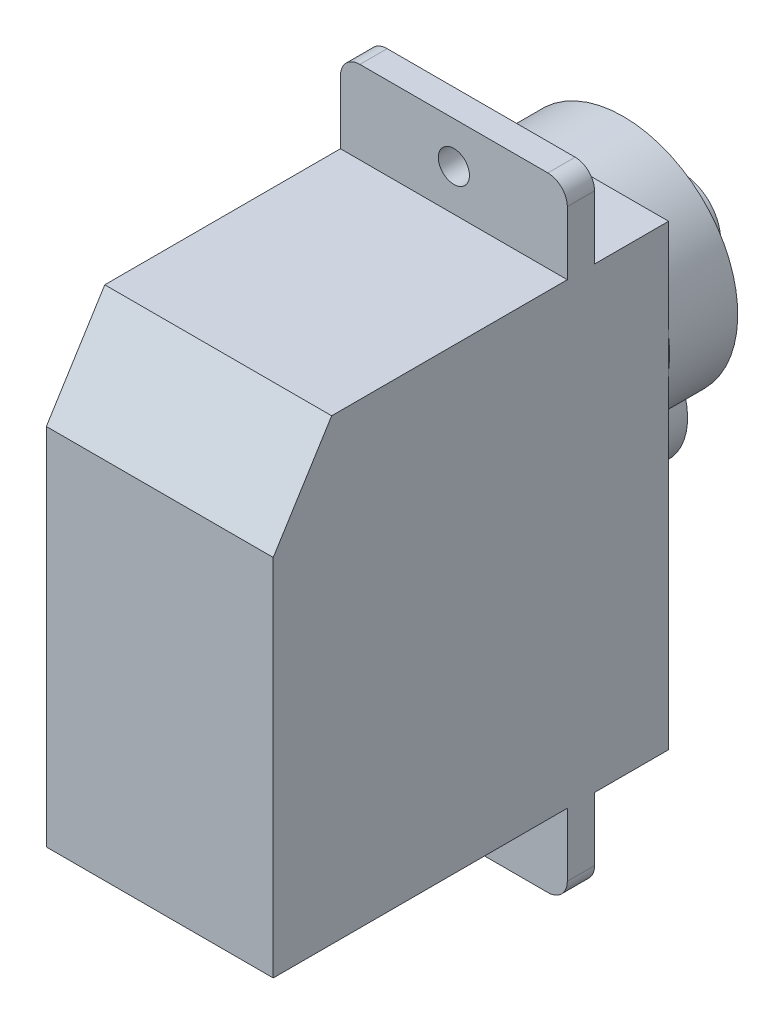
ISO-10303-21;
HEADER;
FILE_DESCRIPTION(('STEP AP214'),'2;1');
FILE_NAME('part.step','',(''),(''),'','','');
FILE_SCHEMA(('AUTOMOTIVE_DESIGN { 1 0 10303 214 1 1 1 1 }'));
ENDSEC;
DATA;
#1=APPLICATION_CONTEXT('core data for automotive mechanical design processes');
#2=APPLICATION_PROTOCOL_DEFINITION('international standard','automotive_design',2000,#1);
#3=PRODUCT_CONTEXT('',#1,'mechanical');
#4=PRODUCT('Part','Part','',(#3));
#5=PRODUCT_RELATED_PRODUCT_CATEGORY('part','',(#4));
#6=PRODUCT_DEFINITION_FORMATION('','',#4);
#7=PRODUCT_DEFINITION_CONTEXT('part definition',#1,'design');
#8=PRODUCT_DEFINITION('design','',#6,#7);
#9=PRODUCT_DEFINITION_SHAPE('','',#8);
#10=(LENGTH_UNIT() NAMED_UNIT(*) SI_UNIT(.MILLI.,.METRE.));
#11=(NAMED_UNIT(*) PLANE_ANGLE_UNIT() SI_UNIT($,.RADIAN.));
#12=(NAMED_UNIT(*) SI_UNIT($,.STERADIAN.) SOLID_ANGLE_UNIT());
#13=UNCERTAINTY_MEASURE_WITH_UNIT(LENGTH_MEASURE(1.E-05),#10,'distance_accuracy_value','');
#14=(GEOMETRIC_REPRESENTATION_CONTEXT(3) GLOBAL_UNCERTAINTY_ASSIGNED_CONTEXT((#13)) GLOBAL_UNIT_ASSIGNED_CONTEXT((#10,
#11,#12)) REPRESENTATION_CONTEXT('',''));
#15=CARTESIAN_POINT('',(0.,0.,0.));
#16=DIRECTION('',(0.,0.,1.));
#17=DIRECTION('',(1.,0.,0.));
#18=AXIS2_PLACEMENT_3D('',#15,#16,#17);
#19=CARTESIAN_POINT('',(-5.875,11.75,5.2));
#20=DIRECTION('',(0.,0.,-1.));
#21=DIRECTION('',(-1.,0.,0.));
#22=AXIS2_PLACEMENT_3D('',#19,#20,#21);
#23=PLANE('',#22);
#24=DIRECTION('',(0.,1.,0.));
#25=VECTOR('',#24,1.);
#26=CARTESIAN_POINT('',(5.825,11.75,5.2));
#27=LINE('',#26,#25);
#28=CARTESIAN_POINT('',(5.825,11.75,5.2));
#29=VERTEX_POINT('',#28);
#30=CARTESIAN_POINT('',(5.825,15.,5.2));
#31=VERTEX_POINT('',#30);
#32=EDGE_CURVE('E192',#29,#31,#27,.T.);
#33=ORIENTED_EDGE('',*,*,#32,.T.);
#34=CARTESIAN_POINT('',(4.825,15.,5.2));
#35=DIRECTION('',(0.,0.,-1.));
#36=DIRECTION('',(-1.,0.,0.));
#37=AXIS2_PLACEMENT_3D('',#34,#35,#36);
#38=CIRCLE('',#37,1.);
#39=CARTESIAN_POINT('',(4.825,16.,5.2));
#40=VERTEX_POINT('',#39);
#41=EDGE_CURVE('E331',#31,#40,#38,.F.);
#42=ORIENTED_EDGE('',*,*,#41,.T.);
#43=DIRECTION('',(1.,0.,0.));
#44=VECTOR('',#43,1.);
#45=CARTESIAN_POINT('',(-5.875,16.,5.2));
#46=LINE('',#45,#44);
#47=CARTESIAN_POINT('',(-4.825,16.,5.2));
#48=VERTEX_POINT('',#47);
#49=EDGE_CURVE('E201',#48,#40,#46,.T.);
#50=ORIENTED_EDGE('',*,*,#49,.F.);
#51=CARTESIAN_POINT('',(-4.825,15.,5.2));
#52=DIRECTION('',(0.,0.,-1.));
#53=DIRECTION('',(-1.,0.,0.));
#54=AXIS2_PLACEMENT_3D('',#51,#52,#53);
#55=CIRCLE('',#54,1.);
#56=CARTESIAN_POINT('',(-5.825,15.,5.2));
#57=VERTEX_POINT('',#56);
#58=EDGE_CURVE('E329',#48,#57,#55,.F.);
#59=ORIENTED_EDGE('',*,*,#58,.T.);
#60=DIRECTION('',(0.,-1.,0.));
#61=VECTOR('',#60,1.);
#62=CARTESIAN_POINT('',(-5.825,0.,5.2));
#63=LINE('',#62,#61);
#64=CARTESIAN_POINT('',(-5.825,11.75,5.2));
#65=VERTEX_POINT('',#64);
#66=EDGE_CURVE('E200',#57,#65,#63,.T.);
#67=ORIENTED_EDGE('',*,*,#66,.T.);
#68=DIRECTION('',(1.,0.,0.));
#69=VECTOR('',#68,1.);
#70=CARTESIAN_POINT('',(-5.875,11.75,5.2));
#71=LINE('',#70,#69);
#72=EDGE_CURVE('E186',#65,#29,#71,.T.);
#73=ORIENTED_EDGE('',*,*,#72,.T.);
#74=EDGE_LOOP('',(#33,#42,#50,#59,#67,#73));
#75=FACE_BOUND('',#74,.T.);
#76=CARTESIAN_POINT('',(0.,13.875,5.20000000000001));
#77=DIRECTION('',(0.,0.,1.));
#78=DIRECTION('',(1.,0.,0.));
#79=AXIS2_PLACEMENT_3D('',#76,#77,#78);
#80=CIRCLE('',#79,0.799999999999988);
#81=CARTESIAN_POINT('',(0.799999999999986,13.875,5.20000000000001));
#82=VERTEX_POINT('',#81);
#83=EDGE_CURVE('E308',#82,#82,#80,.T.);
#84=ORIENTED_EDGE('',*,*,#83,.F.);
#85=EDGE_LOOP('',(#84));
#86=FACE_BOUND('',#85,.T.);
#87=ADVANCED_FACE('F34',(#75,#86),#23,.F.);
#88=CARTESIAN_POINT('',(5.825,16.,0.));
#89=DIRECTION('',(0.,0.,-1.));
#90=DIRECTION('',(-1.,0.,0.));
#91=AXIS2_PLACEMENT_3D('',#88,#89,#90);
#92=PLANE('',#91);
#93=DIRECTION('',(-1.,0.,0.));
#94=VECTOR('',#93,1.);
#95=CARTESIAN_POINT('',(5.87500000000001,11.75,0.));
#96=LINE('',#95,#94);
#97=CARTESIAN_POINT('',(5.825,11.75,0.));
#98=VERTEX_POINT('',#97);
#99=CARTESIAN_POINT('',(0.,11.75,0.));
#100=VERTEX_POINT('',#99);
#101=EDGE_CURVE('E251',#98,#100,#96,.T.);
#102=ORIENTED_EDGE('',*,*,#101,.F.);
#103=DIRECTION('',(0.,-1.,0.));
#104=VECTOR('',#103,1.);
#105=CARTESIAN_POINT('',(5.825,16.,0.));
#106=LINE('',#105,#104);
#107=CARTESIAN_POINT('',(5.825,6.63985292703891,0.));
#108=VERTEX_POINT('',#107);
#109=EDGE_CURVE('E279',#98,#108,#106,.T.);
#110=ORIENTED_EDGE('',*,*,#109,.T.);
#111=CARTESIAN_POINT('',(0.,5.875,0.));
#112=DIRECTION('',(0.,0.,-1.));
#113=DIRECTION('',(1.,0.,0.));
#114=AXIS2_PLACEMENT_3D('',#111,#112,#113);
#115=CIRCLE('',#114,5.875);
#116=EDGE_CURVE('E271',#100,#108,#115,.T.);
#117=ORIENTED_EDGE('',*,*,#116,.F.);
#118=EDGE_LOOP('',(#102,#110,#117));
#119=FACE_BOUND('',#118,.T.);
#120=ADVANCED_FACE('F403',(#119),#92,.T.);
#121=CARTESIAN_POINT('',(-5.825,11.75,0.));
#122=VERTEX_POINT('',#121);
#123=EDGE_CURVE('E244',#100,#122,#96,.T.);
#124=ORIENTED_EDGE('',*,*,#123,.F.);
#125=CARTESIAN_POINT('',(-5.825,6.6398529270389,0.));
#126=VERTEX_POINT('',#125);
#127=EDGE_CURVE('E295',#126,#100,#115,.T.);
#128=ORIENTED_EDGE('',*,*,#127,.F.);
#129=DIRECTION('',(0.,-1.,0.));
#130=VECTOR('',#129,1.);
#131=CARTESIAN_POINT('',(-5.825,16.,0.));
#132=LINE('',#131,#130);
#133=EDGE_CURVE('E286',#122,#126,#132,.T.);
#134=ORIENTED_EDGE('',*,*,#133,.F.);
#135=EDGE_LOOP('',(#124,#128,#134));
#136=FACE_BOUND('',#135,.T.);
#137=ADVANCED_FACE('F362',(#136),#92,.T.);
#138=DIRECTION('',(1.,0.,0.));
#139=VECTOR('',#138,1.);
#140=CARTESIAN_POINT('',(-5.875,-11.75,0.));
#141=LINE('',#140,#139);
#142=CARTESIAN_POINT('',(-5.825,-11.75,0.));
#143=VERTEX_POINT('',#142);
#144=CARTESIAN_POINT('',(5.825,-11.75,0.));
#145=VERTEX_POINT('',#144);
#146=EDGE_CURVE('E232',#143,#145,#141,.T.);
#147=ORIENTED_EDGE('',*,*,#146,.F.);
#148=CARTESIAN_POINT('',(-5.825,5.1101470729611,0.));
#149=VERTEX_POINT('',#148);
#150=EDGE_CURVE('E278',#149,#143,#132,.T.);
#151=ORIENTED_EDGE('',*,*,#150,.F.);
#152=CARTESIAN_POINT('',(-3.16717949990341,0.926808510638299,0.));
#153=VERTEX_POINT('',#152);
#154=EDGE_CURVE('E262',#153,#149,#115,.T.);
#155=ORIENTED_EDGE('',*,*,#154,.F.);
#156=CARTESIAN_POINT('',(0.,0.,0.));
#157=DIRECTION('',(0.,0.,-1.));
#158=DIRECTION('',(1.,0.,0.));
#159=AXIS2_PLACEMENT_3D('',#156,#157,#158);
#160=CIRCLE('',#159,3.3);
#161=CARTESIAN_POINT('',(3.16717949990341,0.926808510638298,0.));
#162=VERTEX_POINT('',#161);
#163=EDGE_CURVE('E257',#162,#153,#160,.T.);
#164=ORIENTED_EDGE('',*,*,#163,.F.);
#165=CARTESIAN_POINT('',(5.825,5.11014707296108,0.));
#166=VERTEX_POINT('',#165);
#167=EDGE_CURVE('E272',#166,#162,#115,.T.);
#168=ORIENTED_EDGE('',*,*,#167,.F.);
#169=EDGE_CURVE('E283',#166,#145,#106,.T.);
#170=ORIENTED_EDGE('',*,*,#169,.T.);
#171=EDGE_LOOP('',(#147,#151,#155,#164,#168,#170));
#172=FACE_BOUND('',#171,.T.);
#173=ADVANCED_FACE('F410',(#172),#92,.T.);
#174=CARTESIAN_POINT('',(5.825,16.,20.3));
#175=DIRECTION('',(0.,1.,0.));
#176=DIRECTION('',(-1.,0.,0.));
#177=AXIS2_PLACEMENT_3D('',#174,#175,#176);
#178=PLANE('',#177);
#179=ORIENTED_EDGE('',*,*,#49,.T.);
#180=DIRECTION('',(0.,0.,-1.));
#181=VECTOR('',#180,1.);
#182=CARTESIAN_POINT('',(4.825,16.,3.8));
#183=LINE('',#182,#181);
#184=CARTESIAN_POINT('',(4.825,16.,3.8));
#185=VERTEX_POINT('',#184);
#186=EDGE_CURVE('E319',#40,#185,#183,.T.);
#187=ORIENTED_EDGE('',*,*,#186,.T.);
#188=DIRECTION('',(-1.,0.,0.));
#189=VECTOR('',#188,1.);
#190=CARTESIAN_POINT('',(5.87500000000001,16.,3.8));
#191=LINE('',#190,#189);
#192=CARTESIAN_POINT('',(-4.825,16.,3.8));
#193=VERTEX_POINT('',#192);
#194=EDGE_CURVE('E245',#185,#193,#191,.T.);
#195=ORIENTED_EDGE('',*,*,#194,.T.);
#196=DIRECTION('',(0.,0.,-1.));
#197=VECTOR('',#196,1.);
#198=CARTESIAN_POINT('',(-4.825,16.,20.3));
#199=LINE('',#198,#197);
#200=EDGE_CURVE('E317',#193,#48,#199,.F.);
#201=ORIENTED_EDGE('',*,*,#200,.T.);
#202=EDGE_LOOP('',(#179,#187,#195,#201));
#203=FACE_BOUND('',#202,.T.);
#204=ADVANCED_FACE('F654',(#203),#178,.T.);
#205=CARTESIAN_POINT('',(5.825,-16.,20.3));
#206=DIRECTION('',(0.,0.,1.));
#207=DIRECTION('',(1.,0.,0.));
#208=AXIS2_PLACEMENT_3D('',#205,#206,#207);
#209=PLANE('',#208);
#210=DIRECTION('',(0.,1.,0.));
#211=VECTOR('',#210,1.);
#212=CARTESIAN_POINT('',(5.825,-16.,20.3));
#213=LINE('',#212,#211);
#214=CARTESIAN_POINT('',(5.825,-11.75,20.3));
#215=VERTEX_POINT('',#214);
#216=CARTESIAN_POINT('',(5.825,6.95,20.3));
#217=VERTEX_POINT('',#216);
#218=EDGE_CURVE('E281',#215,#217,#213,.T.);
#219=ORIENTED_EDGE('',*,*,#218,.T.);
#220=DIRECTION('',(-1.,0.,0.));
#221=VECTOR('',#220,1.);
#222=CARTESIAN_POINT('',(-5.825,6.95,20.3));
#223=LINE('',#222,#221);
#224=CARTESIAN_POINT('',(-5.825,6.95,20.3));
#225=VERTEX_POINT('',#224);
#226=EDGE_CURVE('E313',#217,#225,#223,.T.);
#227=ORIENTED_EDGE('',*,*,#226,.T.);
#228=DIRECTION('',(0.,1.,0.));
#229=VECTOR('',#228,1.);
#230=CARTESIAN_POINT('',(-5.825,-16.,20.3));
#231=LINE('',#230,#229);
#232=CARTESIAN_POINT('',(-5.825,-11.75,20.3));
#233=VERTEX_POINT('',#232);
#234=EDGE_CURVE('E288',#233,#225,#231,.T.);
#235=ORIENTED_EDGE('',*,*,#234,.F.);
#236=DIRECTION('',(1.,0.,0.));
#237=VECTOR('',#236,1.);
#238=CARTESIAN_POINT('',(-5.875,-11.75,20.3));
#239=LINE('',#238,#237);
#240=EDGE_CURVE('E221',#233,#215,#239,.T.);
#241=ORIENTED_EDGE('',*,*,#240,.T.);
#242=EDGE_LOOP('',(#219,#227,#235,#241));
#243=FACE_BOUND('',#242,.T.);
#244=ADVANCED_FACE('F646',(#243),#209,.T.);
#245=CARTESIAN_POINT('',(5.825,-16.,0.));
#246=DIRECTION('',(0.,-1.,0.));
#247=DIRECTION('',(1.,0.,0.));
#248=AXIS2_PLACEMENT_3D('',#245,#246,#247);
#249=PLANE('',#248);
#250=DIRECTION('',(1.,0.,0.));
#251=VECTOR('',#250,1.);
#252=CARTESIAN_POINT('',(-5.875,-16.,3.8));
#253=LINE('',#252,#251);
#254=CARTESIAN_POINT('',(-4.825,-16.,3.8));
#255=VERTEX_POINT('',#254);
#256=CARTESIAN_POINT('',(4.825,-16.,3.8));
#257=VERTEX_POINT('',#256);
#258=EDGE_CURVE('E235',#255,#257,#253,.T.);
#259=ORIENTED_EDGE('',*,*,#258,.T.);
#260=DIRECTION('',(0.,0.,1.));
#261=VECTOR('',#260,1.);
#262=CARTESIAN_POINT('',(4.825,-16.,5.2));
#263=LINE('',#262,#261);
#264=CARTESIAN_POINT('',(4.825,-16.,5.2));
#265=VERTEX_POINT('',#264);
#266=EDGE_CURVE('E335',#257,#265,#263,.T.);
#267=ORIENTED_EDGE('',*,*,#266,.T.);
#268=DIRECTION('',(1.,0.,0.));
#269=VECTOR('',#268,1.);
#270=CARTESIAN_POINT('',(-5.875,-16.,5.2));
#271=LINE('',#270,#269);
#272=CARTESIAN_POINT('',(-4.825,-16.,5.2));
#273=VERTEX_POINT('',#272);
#274=EDGE_CURVE('E217',#273,#265,#271,.T.);
#275=ORIENTED_EDGE('',*,*,#274,.F.);
#276=DIRECTION('',(0.,0.,1.));
#277=VECTOR('',#276,1.);
#278=CARTESIAN_POINT('',(-4.82500000000001,-16.,0.));
#279=LINE('',#278,#277);
#280=EDGE_CURVE('E333',#273,#255,#279,.F.);
#281=ORIENTED_EDGE('',*,*,#280,.T.);
#282=EDGE_LOOP('',(#259,#267,#275,#281));
#283=FACE_BOUND('',#282,.T.);
#284=ADVANCED_FACE('F638',(#283),#249,.T.);
#285=CARTESIAN_POINT('',(5.825,0.,0.));
#286=DIRECTION('',(-1.,0.,0.));
#287=DIRECTION('',(0.,-1.,0.));
#288=AXIS2_PLACEMENT_3D('',#285,#286,#287);
#289=PLANE('',#288);
#290=DIRECTION('',(0.,1.,0.));
#291=VECTOR('',#290,1.);
#292=CARTESIAN_POINT('',(5.825,0.,3.8));
#293=LINE('',#292,#291);
#294=CARTESIAN_POINT('',(5.825,11.75,3.8));
#295=VERTEX_POINT('',#294);
#296=CARTESIAN_POINT('',(5.825,15.,3.8));
#297=VERTEX_POINT('',#296);
#298=EDGE_CURVE('E255',#295,#297,#293,.T.);
#299=ORIENTED_EDGE('',*,*,#298,.T.);
#300=DIRECTION('',(0.,0.,-1.));
#301=VECTOR('',#300,1.);
#302=CARTESIAN_POINT('',(5.825,15.,5.2));
#303=LINE('',#302,#301);
#304=EDGE_CURVE('E206',#297,#31,#303,.F.);
#305=ORIENTED_EDGE('',*,*,#304,.T.);
#306=ORIENTED_EDGE('',*,*,#32,.F.);
#307=DIRECTION('',(0.,0.,-1.));
#308=VECTOR('',#307,1.);
#309=CARTESIAN_POINT('',(5.825,11.75,20.3));
#310=LINE('',#309,#308);
#311=CARTESIAN_POINT('',(5.825,11.75,17.3));
#312=VERTEX_POINT('',#311);
#313=EDGE_CURVE('E182',#312,#29,#310,.T.);
#314=ORIENTED_EDGE('',*,*,#313,.F.);
#315=DIRECTION('',(0.,-0.847998304005087,0.529998940003182));
#316=VECTOR('',#315,1.);
#317=CARTESIAN_POINT('',(5.825,11.75,17.3));
#318=LINE('',#317,#316);
#319=EDGE_CURVE('E311',#312,#217,#318,.T.);
#320=ORIENTED_EDGE('',*,*,#319,.T.);
#321=ORIENTED_EDGE('',*,*,#218,.F.);
#322=DIRECTION('',(0.,0.,1.));
#323=VECTOR('',#322,1.);
#324=CARTESIAN_POINT('',(5.825,-11.75,5.2));
#325=LINE('',#324,#323);
#326=CARTESIAN_POINT('',(5.825,-11.75,5.2));
#327=VERTEX_POINT('',#326);
#328=EDGE_CURVE('E214',#327,#215,#325,.T.);
#329=ORIENTED_EDGE('',*,*,#328,.F.);
#330=DIRECTION('',(0.,1.,0.));
#331=VECTOR('',#330,1.);
#332=CARTESIAN_POINT('',(5.825,-16.,5.2));
#333=LINE('',#332,#331);
#334=CARTESIAN_POINT('',(5.825,-15.,5.2));
#335=VERTEX_POINT('',#334);
#336=EDGE_CURVE('E211',#335,#327,#333,.T.);
#337=ORIENTED_EDGE('',*,*,#336,.F.);
#338=DIRECTION('',(0.,0.,1.));
#339=VECTOR('',#338,1.);
#340=CARTESIAN_POINT('',(5.825,-15.,3.8));
#341=LINE('',#340,#339);
#342=CARTESIAN_POINT('',(5.825,-15.,3.8));
#343=VERTEX_POINT('',#342);
#344=EDGE_CURVE('E326',#335,#343,#341,.F.);
#345=ORIENTED_EDGE('',*,*,#344,.T.);
#346=DIRECTION('',(0.,-1.,0.));
#347=VECTOR('',#346,1.);
#348=CARTESIAN_POINT('',(5.825,-11.75,3.8));
#349=LINE('',#348,#347);
#350=CARTESIAN_POINT('',(5.825,-11.75,3.8));
#351=VERTEX_POINT('',#350);
#352=EDGE_CURVE('E228',#351,#343,#349,.T.);
#353=ORIENTED_EDGE('',*,*,#352,.F.);
#354=DIRECTION('',(0.,0.,1.));
#355=VECTOR('',#354,1.);
#356=CARTESIAN_POINT('',(5.825,-11.75,0.));
#357=LINE('',#356,#355);
#358=EDGE_CURVE('E220',#145,#351,#357,.T.);
#359=ORIENTED_EDGE('',*,*,#358,.F.);
#360=ORIENTED_EDGE('',*,*,#169,.F.);
#361=EDGE_CURVE('E282',#108,#166,#106,.T.);
#362=ORIENTED_EDGE('',*,*,#361,.F.);
#363=ORIENTED_EDGE('',*,*,#109,.F.);
#364=DIRECTION('',(0.,0.,1.));
#365=VECTOR('',#364,1.);
#366=CARTESIAN_POINT('',(5.825,11.75,0.));
#367=LINE('',#366,#365);
#368=EDGE_CURVE('E248',#98,#295,#367,.T.);
#369=ORIENTED_EDGE('',*,*,#368,.T.);
#370=EDGE_LOOP('',(#299,#305,#306,#314,#320,#321,#329,#337,#345,#353,#359,#360,#362,#363,#369));
#371=FACE_BOUND('',#370,.T.);
#372=ADVANCED_FACE('F204',(#371),#289,.F.);
#373=CARTESIAN_POINT('',(-5.825,0.,0.));
#374=DIRECTION('',(-1.,0.,0.));
#375=DIRECTION('',(0.,-1.,0.));
#376=AXIS2_PLACEMENT_3D('',#373,#374,#375);
#377=PLANE('',#376);
#378=DIRECTION('',(0.,1.,0.));
#379=VECTOR('',#378,1.);
#380=CARTESIAN_POINT('',(-5.825,0.,3.80000000000001));
#381=LINE('',#380,#379);
#382=CARTESIAN_POINT('',(-5.825,-15.,3.8));
#383=VERTEX_POINT('',#382);
#384=CARTESIAN_POINT('',(-5.825,-11.75,3.8));
#385=VERTEX_POINT('',#384);
#386=EDGE_CURVE('E292',#383,#385,#381,.T.);
#387=ORIENTED_EDGE('',*,*,#386,.F.);
#388=DIRECTION('',(0.,0.,1.));
#389=VECTOR('',#388,1.);
#390=CARTESIAN_POINT('',(-5.825,-15.,0.));
#391=LINE('',#390,#389);
#392=CARTESIAN_POINT('',(-5.825,-15.,5.2));
#393=VERTEX_POINT('',#392);
#394=EDGE_CURVE('E11',#383,#393,#391,.T.);
#395=ORIENTED_EDGE('',*,*,#394,.T.);
#396=DIRECTION('',(0.,-1.,0.));
#397=VECTOR('',#396,1.);
#398=CARTESIAN_POINT('',(-5.825,0.,5.20000000000001));
#399=LINE('',#398,#397);
#400=CARTESIAN_POINT('',(-5.825,-11.75,5.2));
#401=VERTEX_POINT('',#400);
#402=EDGE_CURVE('E299',#401,#393,#399,.T.);
#403=ORIENTED_EDGE('',*,*,#402,.F.);
#404=DIRECTION('',(0.,0.,-1.));
#405=VECTOR('',#404,1.);
#406=CARTESIAN_POINT('',(-5.825,-11.75,0.));
#407=LINE('',#406,#405);
#408=EDGE_CURVE('E297',#233,#401,#407,.T.);
#409=ORIENTED_EDGE('',*,*,#408,.F.);
#410=ORIENTED_EDGE('',*,*,#234,.T.);
#411=DIRECTION('',(0.,0.847998304005087,-0.529998940003182));
#412=VECTOR('',#411,1.);
#413=CARTESIAN_POINT('',(-5.825,11.0758426966293,17.7213483146067));
#414=LINE('',#413,#412);
#415=CARTESIAN_POINT('',(-5.825,11.75,17.3));
#416=VERTEX_POINT('',#415);
#417=EDGE_CURVE('E315',#225,#416,#414,.T.);
#418=ORIENTED_EDGE('',*,*,#417,.T.);
#419=DIRECTION('',(0.,0.,1.));
#420=VECTOR('',#419,1.);
#421=CARTESIAN_POINT('',(-5.825,11.75,0.));
#422=LINE('',#421,#420);
#423=EDGE_CURVE('E303',#65,#416,#422,.T.);
#424=ORIENTED_EDGE('',*,*,#423,.F.);
#425=ORIENTED_EDGE('',*,*,#66,.F.);
#426=DIRECTION('',(0.,0.,-1.));
#427=VECTOR('',#426,1.);
#428=CARTESIAN_POINT('',(-5.825,15.,0.));
#429=LINE('',#428,#427);
#430=CARTESIAN_POINT('',(-5.825,15.,3.8));
#431=VERTEX_POINT('',#430);
#432=EDGE_CURVE('E42',#57,#431,#429,.T.);
#433=ORIENTED_EDGE('',*,*,#432,.T.);
#434=DIRECTION('',(0.,1.,0.));
#435=VECTOR('',#434,1.);
#436=CARTESIAN_POINT('',(-5.825,11.75,3.8));
#437=LINE('',#436,#435);
#438=CARTESIAN_POINT('',(-5.825,11.75,3.8));
#439=VERTEX_POINT('',#438);
#440=EDGE_CURVE('E241',#439,#431,#437,.T.);
#441=ORIENTED_EDGE('',*,*,#440,.F.);
#442=DIRECTION('',(0.,0.,1.));
#443=VECTOR('',#442,1.);
#444=CARTESIAN_POINT('',(-5.825,11.75,0.));
#445=LINE('',#444,#443);
#446=EDGE_CURVE('E234',#122,#439,#445,.T.);
#447=ORIENTED_EDGE('',*,*,#446,.F.);
#448=ORIENTED_EDGE('',*,*,#133,.T.);
#449=EDGE_CURVE('E289',#126,#149,#132,.T.);
#450=ORIENTED_EDGE('',*,*,#449,.T.);
#451=ORIENTED_EDGE('',*,*,#150,.T.);
#452=DIRECTION('',(0.,0.,-1.));
#453=VECTOR('',#452,1.);
#454=CARTESIAN_POINT('',(-5.825,-11.75,0.));
#455=LINE('',#454,#453);
#456=EDGE_CURVE('E294',#385,#143,#455,.T.);
#457=ORIENTED_EDGE('',*,*,#456,.F.);
#458=EDGE_LOOP('',(#387,#395,#403,#409,#410,#418,#424,#425,#433,#441,#447,#448,#450,#451,#457));
#459=FACE_BOUND('',#458,.T.);
#460=ADVANCED_FACE('F347',(#459),#377,.T.);
#461=CARTESIAN_POINT('',(0.,2.9375,0.));
#462=DIRECTION('',(0.,0.,1.));
#463=DIRECTION('',(1.,0.,0.));
#464=AXIS2_PLACEMENT_3D('',#461,#462,#463);
#465=PLANE('',#464);
#466=ORIENTED_EDGE('',*,*,#449,.F.);
#467=EDGE_CURVE('E270',#149,#126,#115,.T.);
#468=ORIENTED_EDGE('',*,*,#467,.F.);
#469=EDGE_LOOP('',(#466,#468));
#470=FACE_BOUND('',#469,.T.);
#471=ADVANCED_FACE('F371',(#470),#465,.T.);
#472=CARTESIAN_POINT('',(0.,0.,-3.5));
#473=DIRECTION('',(0.,0.,1.));
#474=DIRECTION('',(1.,0.,0.));
#475=AXIS2_PLACEMENT_3D('',#472,#473,#474);
#476=CYLINDRICAL_SURFACE('',#475,3.3);
#477=ORIENTED_EDGE('',*,*,#163,.T.);
#478=DIRECTION('',(0.,0.,1.));
#479=VECTOR('',#478,1.);
#480=CARTESIAN_POINT('',(-3.16717949990341,0.926808510638299,-3.5));
#481=LINE('',#480,#479);
#482=CARTESIAN_POINT('',(-3.16717949990341,0.926808510638299,-3.5));
#483=VERTEX_POINT('',#482);
#484=EDGE_CURVE('E275',#483,#153,#481,.T.);
#485=ORIENTED_EDGE('',*,*,#484,.F.);
#486=CARTESIAN_POINT('',(0.,0.,-3.5));
#487=DIRECTION('',(0.,0.,-1.));
#488=DIRECTION('',(1.,0.,0.));
#489=AXIS2_PLACEMENT_3D('',#486,#487,#488);
#490=CIRCLE('',#489,3.3);
#491=CARTESIAN_POINT('',(3.16717949990341,0.926808510638298,-3.5));
#492=VERTEX_POINT('',#491);
#493=EDGE_CURVE('E258',#492,#483,#490,.T.);
#494=ORIENTED_EDGE('',*,*,#493,.F.);
#495=DIRECTION('',(0.,0.,1.));
#496=VECTOR('',#495,1.);
#497=CARTESIAN_POINT('',(3.16717949990341,0.926808510638298,-3.5));
#498=LINE('',#497,#496);
#499=EDGE_CURVE('E264',#492,#162,#498,.T.);
#500=ORIENTED_EDGE('',*,*,#499,.T.);
#501=EDGE_LOOP('',(#477,#485,#494,#500));
#502=FACE_BOUND('',#501,.T.);
#503=ADVANCED_FACE('F384',(#502),#476,.T.);
#504=CARTESIAN_POINT('',(0.,5.875,-3.5));
#505=DIRECTION('',(0.,0.,1.));
#506=DIRECTION('',(1.,0.,0.));
#507=AXIS2_PLACEMENT_3D('',#504,#505,#506);
#508=CYLINDRICAL_SURFACE('',#507,5.875);
#509=ORIENTED_EDGE('',*,*,#154,.T.);
#510=ORIENTED_EDGE('',*,*,#467,.T.);
#511=ORIENTED_EDGE('',*,*,#127,.T.);
#512=ORIENTED_EDGE('',*,*,#116,.T.);
#513=EDGE_CURVE('E267',#108,#166,#115,.T.);
#514=ORIENTED_EDGE('',*,*,#513,.T.);
#515=ORIENTED_EDGE('',*,*,#167,.T.);
#516=ORIENTED_EDGE('',*,*,#499,.F.);
#517=CARTESIAN_POINT('',(0.,5.875,-3.5));
#518=DIRECTION('',(0.,0.,-1.));
#519=DIRECTION('',(1.,0.,0.));
#520=AXIS2_PLACEMENT_3D('',#517,#518,#519);
#521=CIRCLE('',#520,5.875);
#522=EDGE_CURVE('E261',#483,#492,#521,.T.);
#523=ORIENTED_EDGE('',*,*,#522,.F.);
#524=ORIENTED_EDGE('',*,*,#484,.T.);
#525=EDGE_LOOP('',(#509,#510,#511,#512,#514,#515,#516,#523,#524));
#526=FACE_BOUND('',#525,.T.);
#527=ADVANCED_FACE('F373',(#526),#508,.T.);
#528=CARTESIAN_POINT('',(0.,2.9375,-3.5));
#529=DIRECTION('',(0.,0.,1.));
#530=DIRECTION('',(1.,0.,0.));
#531=AXIS2_PLACEMENT_3D('',#528,#529,#530);
#532=PLANE('',#531);
#533=CARTESIAN_POINT('',(0.,0.,-3.5));
#534=DIRECTION('',(0.,0.,-1.));
#535=DIRECTION('',(-1.,0.,0.));
#536=AXIS2_PLACEMENT_3D('',#533,#534,#535);
#537=CIRCLE('',#536,1.);
#538=CARTESIAN_POINT('',(-1.,0.,-3.5));
#539=VERTEX_POINT('',#538);
#540=EDGE_CURVE('E720',#539,#539,#537,.T.);
#541=ORIENTED_EDGE('',*,*,#540,.F.);
#542=EDGE_LOOP('',(#541));
#543=FACE_BOUND('',#542,.T.);
#544=CARTESIAN_POINT('',(0.,5.75,-3.5));
#545=DIRECTION('',(0.,0.,-1.));
#546=DIRECTION('',(-1.,0.,0.));
#547=AXIS2_PLACEMENT_3D('',#544,#545,#546);
#548=CIRCLE('',#547,2.);
#549=CARTESIAN_POINT('',(-2.,5.75,-3.5));
#550=VERTEX_POINT('',#549);
#551=EDGE_CURVE('E193',#550,#550,#548,.T.);
#552=ORIENTED_EDGE('',*,*,#551,.F.);
#553=EDGE_LOOP('',(#552));
#554=FACE_BOUND('',#553,.T.);
#555=ORIENTED_EDGE('',*,*,#493,.T.);
#556=ORIENTED_EDGE('',*,*,#522,.T.);
#557=EDGE_LOOP('',(#555,#556));
#558=FACE_BOUND('',#557,.T.);
#559=ADVANCED_FACE('F387',(#543,#554,#558),#532,.F.);
#560=ORIENTED_EDGE('',*,*,#513,.F.);
#561=ORIENTED_EDGE('',*,*,#361,.T.);
#562=EDGE_LOOP('',(#560,#561));
#563=FACE_BOUND('',#562,.T.);
#564=ADVANCED_FACE('F389',(#563),#465,.T.);
#565=CARTESIAN_POINT('',(5.87500000000001,11.75,3.8));
#566=DIRECTION('',(0.,0.,1.));
#567=DIRECTION('',(1.,0.,0.));
#568=AXIS2_PLACEMENT_3D('',#565,#566,#567);
#569=PLANE('',#568);
#570=CARTESIAN_POINT('',(0.,13.875,3.8));
#571=DIRECTION('',(0.,0.,1.));
#572=DIRECTION('',(1.,0.,0.));
#573=AXIS2_PLACEMENT_3D('',#570,#571,#572);
#574=CIRCLE('',#573,0.799999999999987);
#575=CARTESIAN_POINT('',(0.799999999999986,13.875,3.8));
#576=VERTEX_POINT('',#575);
#577=EDGE_CURVE('E714',#576,#576,#574,.T.);
#578=ORIENTED_EDGE('',*,*,#577,.T.);
#579=EDGE_LOOP('',(#578));
#580=FACE_BOUND('',#579,.T.);
#581=ORIENTED_EDGE('',*,*,#194,.F.);
#582=CARTESIAN_POINT('',(4.825,15.,3.8));
#583=DIRECTION('',(0.,0.,1.));
#584=DIRECTION('',(1.,0.,0.));
#585=AXIS2_PLACEMENT_3D('',#582,#583,#584);
#586=CIRCLE('',#585,1.);
#587=EDGE_CURVE('E324',#185,#297,#586,.F.);
#588=ORIENTED_EDGE('',*,*,#587,.T.);
#589=ORIENTED_EDGE('',*,*,#298,.F.);
#590=DIRECTION('',(-1.,0.,0.));
#591=VECTOR('',#590,1.);
#592=CARTESIAN_POINT('',(5.87500000000001,11.75,3.8));
#593=LINE('',#592,#591);
#594=EDGE_CURVE('E249',#295,#439,#593,.T.);
#595=ORIENTED_EDGE('',*,*,#594,.T.);
#596=ORIENTED_EDGE('',*,*,#440,.T.);
#597=CARTESIAN_POINT('',(-4.825,15.,3.8));
#598=DIRECTION('',(0.,0.,1.));
#599=DIRECTION('',(1.,0.,0.));
#600=AXIS2_PLACEMENT_3D('',#597,#598,#599);
#601=CIRCLE('',#600,1.);
#602=EDGE_CURVE('E322',#431,#193,#601,.F.);
#603=ORIENTED_EDGE('',*,*,#602,.T.);
#604=EDGE_LOOP('',(#581,#588,#589,#595,#596,#603));
#605=FACE_BOUND('',#604,.T.);
#606=ADVANCED_FACE('F353',(#580,#605),#569,.F.);
#607=CARTESIAN_POINT('',(5.87500000000001,11.75,0.));
#608=DIRECTION('',(0.,-1.,0.));
#609=DIRECTION('',(0.,0.,-1.));
#610=AXIS2_PLACEMENT_3D('',#607,#608,#609);
#611=PLANE('',#610);
#612=ORIENTED_EDGE('',*,*,#101,.T.);
#613=ORIENTED_EDGE('',*,*,#123,.T.);
#614=ORIENTED_EDGE('',*,*,#446,.T.);
#615=ORIENTED_EDGE('',*,*,#594,.F.);
#616=ORIENTED_EDGE('',*,*,#368,.F.);
#617=EDGE_LOOP('',(#612,#613,#614,#615,#616));
#618=FACE_BOUND('',#617,.T.);
#619=ADVANCED_FACE('F356',(#618),#611,.F.);
#620=CARTESIAN_POINT('',(-5.875,-11.75,0.));
#621=DIRECTION('',(0.,1.,0.));
#622=DIRECTION('',(0.,0.,1.));
#623=AXIS2_PLACEMENT_3D('',#620,#621,#622);
#624=PLANE('',#623);
#625=ORIENTED_EDGE('',*,*,#456,.T.);
#626=ORIENTED_EDGE('',*,*,#146,.T.);
#627=ORIENTED_EDGE('',*,*,#358,.T.);
#628=DIRECTION('',(1.,0.,0.));
#629=VECTOR('',#628,1.);
#630=CARTESIAN_POINT('',(-5.875,-11.75,3.8));
#631=LINE('',#630,#629);
#632=EDGE_CURVE('E231',#385,#351,#631,.T.);
#633=ORIENTED_EDGE('',*,*,#632,.F.);
#634=EDGE_LOOP('',(#625,#626,#627,#633));
#635=FACE_BOUND('',#634,.T.);
#636=ADVANCED_FACE('F428',(#635),#624,.F.);
#637=CARTESIAN_POINT('',(-5.875,-11.75,3.8));
#638=DIRECTION('',(0.,0.,1.));
#639=DIRECTION('',(0.,-1.,0.));
#640=AXIS2_PLACEMENT_3D('',#637,#638,#639);
#641=PLANE('',#640);
#642=CARTESIAN_POINT('',(0.,-13.875,3.8));
#643=DIRECTION('',(0.,0.,1.));
#644=DIRECTION('',(0.,-1.,0.));
#645=AXIS2_PLACEMENT_3D('',#642,#643,#644);
#646=CIRCLE('',#645,0.799999999999987);
#647=CARTESIAN_POINT('',(0.,-14.675,3.8));
#648=VERTEX_POINT('',#647);
#649=EDGE_CURVE('E305',#648,#648,#646,.T.);
#650=ORIENTED_EDGE('',*,*,#649,.T.);
#651=EDGE_LOOP('',(#650));
#652=FACE_BOUND('',#651,.T.);
#653=ORIENTED_EDGE('',*,*,#352,.T.);
#654=CARTESIAN_POINT('',(4.825,-15.,3.8));
#655=DIRECTION('',(0.,0.,1.));
#656=DIRECTION('',(0.,-1.,0.));
#657=AXIS2_PLACEMENT_3D('',#654,#655,#656);
#658=CIRCLE('',#657,1.);
#659=EDGE_CURVE('E342',#343,#257,#658,.F.);
#660=ORIENTED_EDGE('',*,*,#659,.T.);
#661=ORIENTED_EDGE('',*,*,#258,.F.);
#662=CARTESIAN_POINT('',(-4.825,-15.,3.8));
#663=DIRECTION('',(0.,0.,1.));
#664=DIRECTION('',(0.,-1.,0.));
#665=AXIS2_PLACEMENT_3D('',#662,#663,#664);
#666=CIRCLE('',#665,1.);
#667=EDGE_CURVE('E49',#255,#383,#666,.F.);
#668=ORIENTED_EDGE('',*,*,#667,.T.);
#669=ORIENTED_EDGE('',*,*,#386,.T.);
#670=ORIENTED_EDGE('',*,*,#632,.T.);
#671=EDGE_LOOP('',(#653,#660,#661,#668,#669,#670));
#672=FACE_BOUND('',#671,.T.);
#673=ADVANCED_FACE('F424',(#652,#672),#641,.F.);
#674=CARTESIAN_POINT('',(-5.875,-16.,5.2));
#675=DIRECTION('',(0.,0.,-1.));
#676=DIRECTION('',(0.,1.,0.));
#677=AXIS2_PLACEMENT_3D('',#674,#675,#676);
#678=PLANE('',#677);
#679=CARTESIAN_POINT('',(0.,-13.875,5.20000000000001));
#680=DIRECTION('',(0.,0.,1.));
#681=DIRECTION('',(1.,0.,0.));
#682=AXIS2_PLACEMENT_3D('',#679,#680,#681);
#683=CIRCLE('',#682,0.799999999999988);
#684=CARTESIAN_POINT('',(0.799999999999986,-13.875,5.20000000000001));
#685=VERTEX_POINT('',#684);
#686=EDGE_CURVE('E309',#685,#685,#683,.T.);
#687=ORIENTED_EDGE('',*,*,#686,.F.);
#688=EDGE_LOOP('',(#687));
#689=FACE_BOUND('',#688,.T.);
#690=ORIENTED_EDGE('',*,*,#274,.T.);
#691=CARTESIAN_POINT('',(4.825,-15.,5.2));
#692=DIRECTION('',(0.,0.,-1.));
#693=DIRECTION('',(0.,1.,0.));
#694=AXIS2_PLACEMENT_3D('',#691,#692,#693);
#695=CIRCLE('',#694,1.);
#696=EDGE_CURVE('E339',#265,#335,#695,.F.);
#697=ORIENTED_EDGE('',*,*,#696,.T.);
#698=ORIENTED_EDGE('',*,*,#336,.T.);
#699=DIRECTION('',(1.,0.,0.));
#700=VECTOR('',#699,1.);
#701=CARTESIAN_POINT('',(-5.875,-11.75,5.2));
#702=LINE('',#701,#700);
#703=EDGE_CURVE('E216',#401,#327,#702,.T.);
#704=ORIENTED_EDGE('',*,*,#703,.F.);
#705=ORIENTED_EDGE('',*,*,#402,.T.);
#706=CARTESIAN_POINT('',(-4.825,-15.,5.2));
#707=DIRECTION('',(0.,0.,-1.));
#708=DIRECTION('',(0.,1.,0.));
#709=AXIS2_PLACEMENT_3D('',#706,#707,#708);
#710=CIRCLE('',#709,1.);
#711=EDGE_CURVE('E57',#393,#273,#710,.F.);
#712=ORIENTED_EDGE('',*,*,#711,.T.);
#713=EDGE_LOOP('',(#690,#697,#698,#704,#705,#712));
#714=FACE_BOUND('',#713,.T.);
#715=ADVANCED_FACE('F420',(#689,#714),#678,.F.);
#716=CARTESIAN_POINT('',(-5.875,-11.75,5.2));
#717=DIRECTION('',(0.,1.,0.));
#718=DIRECTION('',(-1.,0.,0.));
#719=AXIS2_PLACEMENT_3D('',#716,#717,#718);
#720=PLANE('',#719);
#721=ORIENTED_EDGE('',*,*,#408,.T.);
#722=ORIENTED_EDGE('',*,*,#703,.T.);
#723=ORIENTED_EDGE('',*,*,#328,.T.);
#724=ORIENTED_EDGE('',*,*,#240,.F.);
#725=EDGE_LOOP('',(#721,#722,#723,#724));
#726=FACE_BOUND('',#725,.T.);
#727=ADVANCED_FACE('F417',(#726),#720,.F.);
#728=CARTESIAN_POINT('',(-5.875,11.75,20.3));
#729=DIRECTION('',(0.,-1.,0.));
#730=DIRECTION('',(1.,0.,0.));
#731=AXIS2_PLACEMENT_3D('',#728,#729,#730);
#732=PLANE('',#731);
#733=ORIENTED_EDGE('',*,*,#423,.T.);
#734=DIRECTION('',(1.,0.,0.));
#735=VECTOR('',#734,1.);
#736=CARTESIAN_POINT('',(5.825,11.75,17.3));
#737=LINE('',#736,#735);
#738=EDGE_CURVE('E189',#416,#312,#737,.T.);
#739=ORIENTED_EDGE('',*,*,#738,.T.);
#740=ORIENTED_EDGE('',*,*,#313,.T.);
#741=ORIENTED_EDGE('',*,*,#72,.F.);
#742=EDGE_LOOP('',(#733,#739,#740,#741));
#743=FACE_BOUND('',#742,.T.);
#744=ADVANCED_FACE('F185',(#743),#732,.F.);
#745=CARTESIAN_POINT('',(0.,5.75,-3.5));
#746=DIRECTION('',(0.,0.,-1.));
#747=DIRECTION('',(-1.,0.,0.));
#748=AXIS2_PLACEMENT_3D('',#745,#746,#747);
#749=CYLINDRICAL_SURFACE('',#748,2.);
#750=ORIENTED_EDGE('',*,*,#551,.T.);
#751=EDGE_LOOP('',(#750));
#752=FACE_BOUND('',#751,.T.);
#753=CARTESIAN_POINT('',(0.,5.75,-6.5));
#754=DIRECTION('',(0.,0.,-1.));
#755=DIRECTION('',(-1.,0.,0.));
#756=AXIS2_PLACEMENT_3D('',#753,#754,#755);
#757=CIRCLE('',#756,2.);
#758=CARTESIAN_POINT('',(-2.,5.75,-6.5));
#759=VERTEX_POINT('',#758);
#760=EDGE_CURVE('E723',#759,#759,#757,.T.);
#761=ORIENTED_EDGE('',*,*,#760,.F.);
#762=EDGE_LOOP('',(#761));
#763=FACE_BOUND('',#762,.T.);
#764=ADVANCED_FACE('F413',(#752,#763),#749,.T.);
#765=CARTESIAN_POINT('',(0.,5.75,-6.5));
#766=DIRECTION('',(0.,0.,-1.));
#767=DIRECTION('',(-1.,0.,0.));
#768=AXIS2_PLACEMENT_3D('',#765,#766,#767);
#769=PLANE('',#768);
#770=ORIENTED_EDGE('',*,*,#760,.T.);
#771=EDGE_LOOP('',(#770));
#772=FACE_BOUND('',#771,.T.);
#773=ADVANCED_FACE('F471',(#772),#769,.T.);
#774=CARTESIAN_POINT('',(0.,0.,-3.5));
#775=DIRECTION('',(0.,0.,-1.));
#776=DIRECTION('',(-1.,0.,0.));
#777=AXIS2_PLACEMENT_3D('',#774,#775,#776);
#778=CYLINDRICAL_SURFACE('',#777,1.);
#779=ORIENTED_EDGE('',*,*,#540,.T.);
#780=EDGE_LOOP('',(#779));
#781=FACE_BOUND('',#780,.T.);
#782=CARTESIAN_POINT('',(0.,0.,-4.5));
#783=DIRECTION('',(0.,0.,-1.));
#784=DIRECTION('',(-1.,0.,0.));
#785=AXIS2_PLACEMENT_3D('',#782,#783,#784);
#786=CIRCLE('',#785,1.);
#787=CARTESIAN_POINT('',(-1.,0.,-4.5));
#788=VERTEX_POINT('',#787);
#789=EDGE_CURVE('E717',#788,#788,#786,.T.);
#790=ORIENTED_EDGE('',*,*,#789,.F.);
#791=EDGE_LOOP('',(#790));
#792=FACE_BOUND('',#791,.T.);
#793=ADVANCED_FACE('F478',(#781,#792),#778,.T.);
#794=CARTESIAN_POINT('',(0.,0.,-4.5));
#795=DIRECTION('',(0.,0.,-1.));
#796=DIRECTION('',(-1.,0.,0.));
#797=AXIS2_PLACEMENT_3D('',#794,#795,#796);
#798=PLANE('',#797);
#799=ORIENTED_EDGE('',*,*,#789,.T.);
#800=EDGE_LOOP('',(#799));
#801=FACE_BOUND('',#800,.T.);
#802=ADVANCED_FACE('F485',(#801),#798,.T.);
#803=CARTESIAN_POINT('',(0.,13.875,5.20000000000001));
#804=DIRECTION('',(0.,0.,1.));
#805=DIRECTION('',(1.,0.,0.));
#806=AXIS2_PLACEMENT_3D('',#803,#804,#805);
#807=CYLINDRICAL_SURFACE('',#806,0.799999999999987);
#808=ORIENTED_EDGE('',*,*,#83,.T.);
#809=EDGE_LOOP('',(#808));
#810=FACE_BOUND('',#809,.T.);
#811=ORIENTED_EDGE('',*,*,#577,.F.);
#812=EDGE_LOOP('',(#811));
#813=FACE_BOUND('',#812,.T.);
#814=ADVANCED_FACE('F493',(#810,#813),#807,.F.);
#815=CARTESIAN_POINT('',(0.,-13.875,5.20000000000001));
#816=DIRECTION('',(0.,0.,1.));
#817=DIRECTION('',(1.,0.,0.));
#818=AXIS2_PLACEMENT_3D('',#815,#816,#817);
#819=CYLINDRICAL_SURFACE('',#818,0.799999999999987);
#820=ORIENTED_EDGE('',*,*,#686,.T.);
#821=EDGE_LOOP('',(#820));
#822=FACE_BOUND('',#821,.T.);
#823=ORIENTED_EDGE('',*,*,#649,.F.);
#824=EDGE_LOOP('',(#823));
#825=FACE_BOUND('',#824,.T.);
#826=ADVANCED_FACE('F501',(#822,#825),#819,.F.);
#827=CARTESIAN_POINT('',(-5.875,11.75,17.3));
#828=DIRECTION('',(0.,0.529998940003182,0.847998304005087));
#829=DIRECTION('',(-1.,0.,0.));
#830=AXIS2_PLACEMENT_3D('',#827,#828,#829);
#831=PLANE('',#830);
#832=ORIENTED_EDGE('',*,*,#417,.F.);
#833=ORIENTED_EDGE('',*,*,#226,.F.);
#834=ORIENTED_EDGE('',*,*,#319,.F.);
#835=ORIENTED_EDGE('',*,*,#738,.F.);
#836=EDGE_LOOP('',(#832,#833,#834,#835));
#837=FACE_BOUND('',#836,.T.);
#838=ADVANCED_FACE('F509',(#837),#831,.T.);
#839=CARTESIAN_POINT('',(4.825,15.,20.3));
#840=DIRECTION('',(0.,0.,1.));
#841=DIRECTION('',(1.,0.,0.));
#842=AXIS2_PLACEMENT_3D('',#839,#840,#841);
#843=CYLINDRICAL_SURFACE('',#842,1.);
#844=ORIENTED_EDGE('',*,*,#41,.F.);
#845=ORIENTED_EDGE('',*,*,#304,.F.);
#846=ORIENTED_EDGE('',*,*,#587,.F.);
#847=ORIENTED_EDGE('',*,*,#186,.F.);
#848=EDGE_LOOP('',(#844,#845,#846,#847));
#849=FACE_BOUND('',#848,.T.);
#850=ADVANCED_FACE('F516',(#849),#843,.T.);
#851=CARTESIAN_POINT('',(4.825,-15.,0.));
#852=DIRECTION('',(0.,0.,-1.));
#853=DIRECTION('',(-1.,0.,0.));
#854=AXIS2_PLACEMENT_3D('',#851,#852,#853);
#855=CYLINDRICAL_SURFACE('',#854,1.);
#856=ORIENTED_EDGE('',*,*,#659,.F.);
#857=ORIENTED_EDGE('',*,*,#344,.F.);
#858=ORIENTED_EDGE('',*,*,#696,.F.);
#859=ORIENTED_EDGE('',*,*,#266,.F.);
#860=EDGE_LOOP('',(#856,#857,#858,#859));
#861=FACE_BOUND('',#860,.T.);
#862=ADVANCED_FACE('F523',(#861),#855,.T.);
#863=CARTESIAN_POINT('',(-4.825,-15.,0.));
#864=DIRECTION('',(0.,0.,1.));
#865=DIRECTION('',(1.,0.,0.));
#866=AXIS2_PLACEMENT_3D('',#863,#864,#865);
#867=CYLINDRICAL_SURFACE('',#866,1.);
#868=ORIENTED_EDGE('',*,*,#667,.F.);
#869=ORIENTED_EDGE('',*,*,#280,.F.);
#870=ORIENTED_EDGE('',*,*,#711,.F.);
#871=ORIENTED_EDGE('',*,*,#394,.F.);
#872=EDGE_LOOP('',(#868,#869,#870,#871));
#873=FACE_BOUND('',#872,.T.);
#874=ADVANCED_FACE('F531',(#873),#867,.T.);
#875=CARTESIAN_POINT('',(-4.825,15.,0.));
#876=DIRECTION('',(0.,0.,-1.));
#877=DIRECTION('',(-1.,0.,0.));
#878=AXIS2_PLACEMENT_3D('',#875,#876,#877);
#879=CYLINDRICAL_SURFACE('',#878,1.);
#880=ORIENTED_EDGE('',*,*,#58,.F.);
#881=ORIENTED_EDGE('',*,*,#200,.F.);
#882=ORIENTED_EDGE('',*,*,#602,.F.);
#883=ORIENTED_EDGE('',*,*,#432,.F.);
#884=EDGE_LOOP('',(#880,#881,#882,#883));
#885=FACE_BOUND('',#884,.T.);
#886=ADVANCED_FACE('F36',(#885),#879,.T.);
#887=CLOSED_SHELL('',(#87,#120,#137,#173,#204,#244,#284,#372,#460,#471,#503,#527,#559,#564,#606,
#619,#636,#673,#715,#727,#744,#764,#773,#793,#802,#814,#826,#838,#850,#862,#874,#886));
#888=MANIFOLD_SOLID_BREP('B2',#887);
#889=ADVANCED_BREP_SHAPE_REPRESENTATION('',(#18,#888),#14);
#890=SHAPE_DEFINITION_REPRESENTATION(#9,#889);
ENDSEC;
END-ISO-10303-21;
